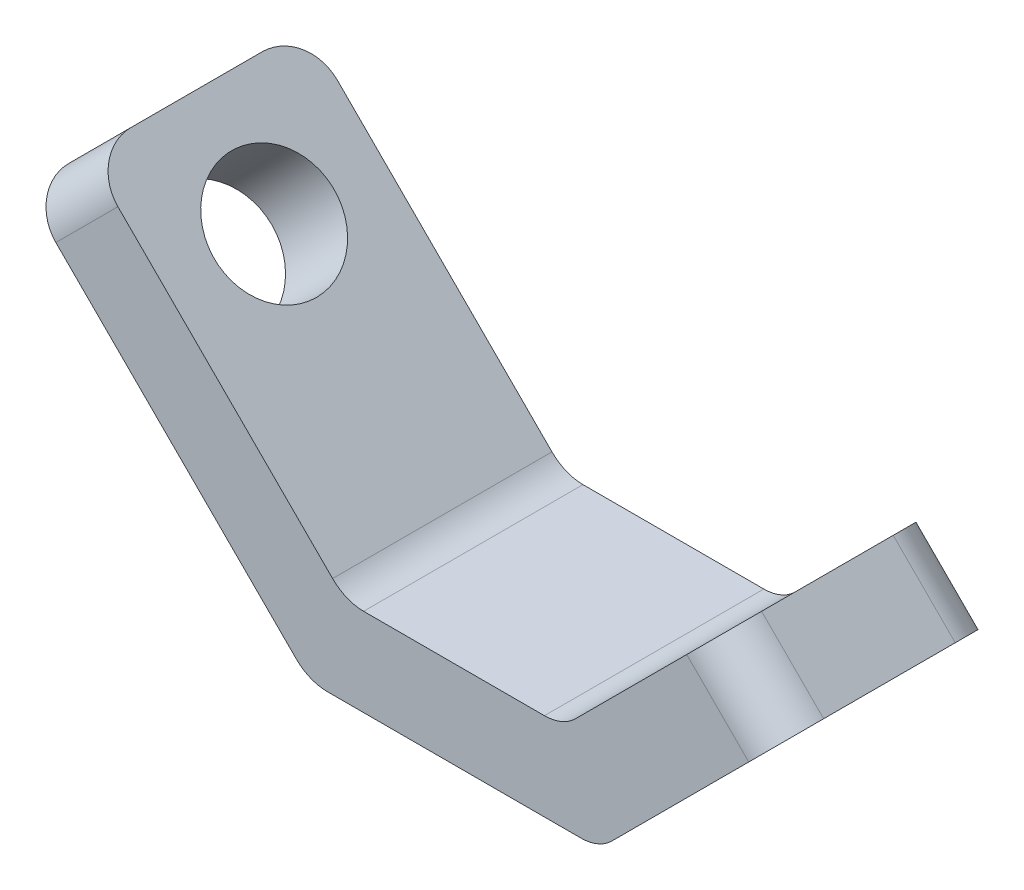
ISO-10303-21;
HEADER;
FILE_DESCRIPTION(('STEP AP214'),'2;1');
FILE_NAME('part.step','',(''),(''),'','','');
FILE_SCHEMA(('AUTOMOTIVE_DESIGN { 1 0 10303 214 1 1 1 1 }'));
ENDSEC;
DATA;
#1=APPLICATION_CONTEXT('core data for automotive mechanical design processes');
#2=APPLICATION_PROTOCOL_DEFINITION('international standard','automotive_design',2000,#1);
#3=PRODUCT_CONTEXT('',#1,'mechanical');
#4=PRODUCT('Part','Part','',(#3));
#5=PRODUCT_RELATED_PRODUCT_CATEGORY('part','',(#4));
#6=PRODUCT_DEFINITION_FORMATION('','',#4);
#7=PRODUCT_DEFINITION_CONTEXT('part definition',#1,'design');
#8=PRODUCT_DEFINITION('design','',#6,#7);
#9=PRODUCT_DEFINITION_SHAPE('','',#8);
#10=(LENGTH_UNIT() NAMED_UNIT(*) SI_UNIT(.MILLI.,.METRE.));
#11=(NAMED_UNIT(*) PLANE_ANGLE_UNIT() SI_UNIT($,.RADIAN.));
#12=(NAMED_UNIT(*) SI_UNIT($,.STERADIAN.) SOLID_ANGLE_UNIT());
#13=UNCERTAINTY_MEASURE_WITH_UNIT(LENGTH_MEASURE(1.E-05),#10,'distance_accuracy_value','');
#14=(GEOMETRIC_REPRESENTATION_CONTEXT(3) GLOBAL_UNCERTAINTY_ASSIGNED_CONTEXT((#13)) GLOBAL_UNIT_ASSIGNED_CONTEXT((#10,
#11,#12)) REPRESENTATION_CONTEXT('',''));
#15=CARTESIAN_POINT('',(0.,0.,0.));
#16=DIRECTION('',(0.,0.,1.));
#17=DIRECTION('',(1.,0.,0.));
#18=AXIS2_PLACEMENT_3D('',#15,#16,#17);
#19=CARTESIAN_POINT('',(19.8198051533946,0.,7.5));
#20=DIRECTION('',(0.,1.,0.));
#21=DIRECTION('',(-1.,0.,0.));
#22=AXIS2_PLACEMENT_3D('',#19,#20,#21);
#23=PLANE('',#22);
#24=DIRECTION('',(1.,0.,0.));
#25=VECTOR('',#24,1.);
#26=CARTESIAN_POINT('',(19.8198051533946,0.,-7.5));
#27=LINE('',#26,#25);
#28=CARTESIAN_POINT('',(1.2426406871193,0.,-7.5));
#29=VERTEX_POINT('',#28);
#30=CARTESIAN_POINT('',(18.5771644662753,0.,-7.5));
#31=VERTEX_POINT('',#30);
#32=EDGE_CURVE('E288',#29,#31,#27,.T.);
#33=ORIENTED_EDGE('',*,*,#32,.T.);
#34=DIRECTION('',(0.,0.,-1.));
#35=VECTOR('',#34,1.);
#36=CARTESIAN_POINT('',(18.5771644662753,0.,7.5));
#37=LINE('',#36,#35);
#38=CARTESIAN_POINT('',(18.5771644662753,0.,7.5));
#39=VERTEX_POINT('',#38);
#40=EDGE_CURVE('E166',#31,#39,#37,.F.);
#41=ORIENTED_EDGE('',*,*,#40,.T.);
#42=DIRECTION('',(1.,0.,0.));
#43=VECTOR('',#42,1.);
#44=CARTESIAN_POINT('',(19.8198051533946,0.,7.5));
#45=LINE('',#44,#43);
#46=CARTESIAN_POINT('',(1.2426406871193,0.,7.5));
#47=VERTEX_POINT('',#46);
#48=EDGE_CURVE('E193',#47,#39,#45,.T.);
#49=ORIENTED_EDGE('',*,*,#48,.F.);
#50=DIRECTION('',(0.,0.,-1.));
#51=VECTOR('',#50,1.);
#52=CARTESIAN_POINT('',(1.24264068711929,0.,7.5));
#53=LINE('',#52,#51);
#54=EDGE_CURVE('E264',#47,#29,#53,.T.);
#55=ORIENTED_EDGE('',*,*,#54,.T.);
#56=EDGE_LOOP('',(#33,#41,#49,#55));
#57=FACE_BOUND('',#56,.T.);
#58=ADVANCED_FACE('F41',(#57),#23,.F.);
#59=CARTESIAN_POINT('',(32.1837661840735,12.363961030679,7.5));
#60=DIRECTION('',(-0.707106781186549,0.707106781186546,0.));
#61=DIRECTION('',(-0.707106781186546,-0.707106781186549,0.));
#62=AXIS2_PLACEMENT_3D('',#59,#60,#61);
#63=PLANE('',#62);
#64=CARTESIAN_POINT('',(26.8804653251744,7.06066017177983,0.));
#65=DIRECTION('',(-0.707106781186549,0.707106781186546,0.));
#66=DIRECTION('',(-0.707106781186546,-0.707106781186549,0.));
#67=AXIS2_PLACEMENT_3D('',#64,#65,#66);
#68=CIRCLE('',#67,4.1);
#69=CARTESIAN_POINT('',(23.9813275223096,4.16152236891498,0.));
#70=VERTEX_POINT('',#69);
#71=EDGE_CURVE('E210',#70,#70,#68,.T.);
#72=ORIENTED_EDGE('',*,*,#71,.T.);
#73=EDGE_LOOP('',(#72));
#74=FACE_BOUND('',#73,.T.);
#75=DIRECTION('',(0.707106781186546,0.707106781186549,0.));
#76=VECTOR('',#75,1.);
#77=CARTESIAN_POINT('',(32.1837661840735,12.363961030679,-7.5));
#78=LINE('',#77,#76);
#79=CARTESIAN_POINT('',(20.698484809835,0.878679656440361,-7.5));
#80=VERTEX_POINT('',#79);
#81=CARTESIAN_POINT('',(30.0624458405139,10.2426406871193,-7.5));
#82=VERTEX_POINT('',#81);
#83=EDGE_CURVE('E187',#80,#82,#78,.T.);
#84=ORIENTED_EDGE('',*,*,#83,.T.);
#85=CARTESIAN_POINT('',(30.0624458405139,10.2426406871193,-4.5));
#86=DIRECTION('',(-0.707106781186549,0.707106781186546,0.));
#87=DIRECTION('',(-0.707106781186546,-0.707106781186549,0.));
#88=AXIS2_PLACEMENT_3D('',#85,#86,#87);
#89=CIRCLE('',#88,3.);
#90=CARTESIAN_POINT('',(32.1837661840735,12.363961030679,-4.5));
#91=VERTEX_POINT('',#90);
#92=EDGE_CURVE('E244',#82,#91,#89,.F.);
#93=ORIENTED_EDGE('',*,*,#92,.T.);
#94=DIRECTION('',(0.,0.,-1.));
#95=VECTOR('',#94,1.);
#96=CARTESIAN_POINT('',(32.1837661840735,12.363961030679,7.5));
#97=LINE('',#96,#95);
#98=CARTESIAN_POINT('',(32.1837661840735,12.363961030679,4.5));
#99=VERTEX_POINT('',#98);
#100=EDGE_CURVE('E203',#99,#91,#97,.T.);
#101=ORIENTED_EDGE('',*,*,#100,.F.);
#102=CARTESIAN_POINT('',(30.0624458405139,10.2426406871193,4.5));
#103=DIRECTION('',(-0.707106781186549,0.707106781186546,0.));
#104=DIRECTION('',(-0.707106781186546,-0.707106781186549,0.));
#105=AXIS2_PLACEMENT_3D('',#102,#103,#104);
#106=CIRCLE('',#105,3.);
#107=CARTESIAN_POINT('',(30.0624458405139,10.2426406871193,7.5));
#108=VERTEX_POINT('',#107);
#109=EDGE_CURVE('E242',#99,#108,#106,.F.);
#110=ORIENTED_EDGE('',*,*,#109,.T.);
#111=DIRECTION('',(0.707106781186546,0.707106781186549,0.));
#112=VECTOR('',#111,1.);
#113=CARTESIAN_POINT('',(32.1837661840735,12.363961030679,7.5));
#114=LINE('',#113,#112);
#115=CARTESIAN_POINT('',(20.698484809835,0.878679656440361,7.5));
#116=VERTEX_POINT('',#115);
#117=EDGE_CURVE('E277',#116,#108,#114,.T.);
#118=ORIENTED_EDGE('',*,*,#117,.F.);
#119=DIRECTION('',(0.,0.,-1.));
#120=VECTOR('',#119,1.);
#121=CARTESIAN_POINT('',(20.698484809835,0.878679656440361,7.5));
#122=LINE('',#121,#120);
#123=EDGE_CURVE('E239',#116,#80,#122,.T.);
#124=ORIENTED_EDGE('',*,*,#123,.T.);
#125=EDGE_LOOP('',(#84,#93,#101,#110,#118,#124));
#126=FACE_BOUND('',#125,.T.);
#127=ADVANCED_FACE('F294',(#74,#126),#63,.F.);
#128=CARTESIAN_POINT('',(27.9411254969542,16.6066017177982,7.5));
#129=DIRECTION('',(-0.707106781186547,-0.707106781186548,0.));
#130=DIRECTION('',(0.707106781186548,-0.707106781186547,0.));
#131=AXIS2_PLACEMENT_3D('',#128,#129,#130);
#132=PLANE('',#131);
#133=ORIENTED_EDGE('',*,*,#100,.T.);
#134=DIRECTION('',(-0.707106781186548,0.707106781186547,0.));
#135=VECTOR('',#134,1.);
#136=CARTESIAN_POINT('',(27.9411254969542,16.6066017177982,-4.5));
#137=LINE('',#136,#135);
#138=CARTESIAN_POINT('',(27.9411254969542,16.6066017177982,-4.5));
#139=VERTEX_POINT('',#138);
#140=EDGE_CURVE('E228',#91,#139,#137,.T.);
#141=ORIENTED_EDGE('',*,*,#140,.T.);
#142=DIRECTION('',(0.,0.,-1.));
#143=VECTOR('',#142,1.);
#144=CARTESIAN_POINT('',(27.9411254969542,16.6066017177982,7.5));
#145=LINE('',#144,#143);
#146=CARTESIAN_POINT('',(27.9411254969542,16.6066017177982,4.5));
#147=VERTEX_POINT('',#146);
#148=EDGE_CURVE('E200',#147,#139,#145,.T.);
#149=ORIENTED_EDGE('',*,*,#148,.F.);
#150=DIRECTION('',(-0.707106781186548,0.707106781186547,0.));
#151=VECTOR('',#150,1.);
#152=CARTESIAN_POINT('',(27.9411254969542,16.6066017177982,4.5));
#153=LINE('',#152,#151);
#154=EDGE_CURVE('E226',#147,#99,#153,.F.);
#155=ORIENTED_EDGE('',*,*,#154,.T.);
#156=EDGE_LOOP('',(#133,#141,#149,#155));
#157=FACE_BOUND('',#156,.T.);
#158=ADVANCED_FACE('F304',(#157),#132,.F.);
#159=CARTESIAN_POINT('',(17.334523779156,5.99999999999999,7.5));
#160=DIRECTION('',(0.70710678118655,-0.707106781186545,0.));
#161=DIRECTION('',(0.707106781186545,0.70710678118655,0.));
#162=AXIS2_PLACEMENT_3D('',#159,#160,#161);
#163=PLANE('',#162);
#164=CARTESIAN_POINT('',(22.6378246380551,11.3033008588991,0.));
#165=DIRECTION('',(0.70710678118655,-0.707106781186545,0.));
#166=DIRECTION('',(0.707106781186545,0.70710678118655,0.));
#167=AXIS2_PLACEMENT_3D('',#164,#165,#166);
#168=CIRCLE('',#167,4.1);
#169=CARTESIAN_POINT('',(25.53696244092,14.202438661764,0.));
#170=VERTEX_POINT('',#169);
#171=EDGE_CURVE('E211',#170,#170,#168,.T.);
#172=ORIENTED_EDGE('',*,*,#171,.T.);
#173=EDGE_LOOP('',(#172));
#174=FACE_BOUND('',#173,.T.);
#175=DIRECTION('',(-0.707106781186545,-0.70710678118655,0.));
#176=VECTOR('',#175,1.);
#177=CARTESIAN_POINT('',(17.334523779156,5.99999999999999,-7.5));
#178=LINE('',#177,#176);
#179=CARTESIAN_POINT('',(25.8198051533946,14.4852813742386,-7.5));
#180=VERTEX_POINT('',#179);
#181=CARTESIAN_POINT('',(18.2132034355964,6.87867965644035,-7.5));
#182=VERTEX_POINT('',#181);
#183=EDGE_CURVE('E182',#180,#182,#178,.T.);
#184=ORIENTED_EDGE('',*,*,#183,.T.);
#185=DIRECTION('',(0.,0.,-1.));
#186=VECTOR('',#185,1.);
#187=CARTESIAN_POINT('',(18.2132034355964,6.87867965644035,7.5));
#188=LINE('',#187,#186);
#189=CARTESIAN_POINT('',(18.2132034355964,6.87867965644035,7.5));
#190=VERTEX_POINT('',#189);
#191=EDGE_CURVE('E160',#182,#190,#188,.F.);
#192=ORIENTED_EDGE('',*,*,#191,.T.);
#193=DIRECTION('',(-0.707106781186545,-0.70710678118655,0.));
#194=VECTOR('',#193,1.);
#195=CARTESIAN_POINT('',(17.334523779156,5.99999999999999,7.5));
#196=LINE('',#195,#194);
#197=CARTESIAN_POINT('',(25.8198051533946,14.4852813742386,7.5));
#198=VERTEX_POINT('',#197);
#199=EDGE_CURVE('E274',#198,#190,#196,.T.);
#200=ORIENTED_EDGE('',*,*,#199,.F.);
#201=CARTESIAN_POINT('',(25.8198051533946,14.4852813742386,4.5));
#202=DIRECTION('',(0.70710678118655,-0.707106781186545,0.));
#203=DIRECTION('',(0.707106781186545,0.70710678118655,0.));
#204=AXIS2_PLACEMENT_3D('',#201,#202,#203);
#205=CIRCLE('',#204,3.);
#206=EDGE_CURVE('E176',#198,#147,#205,.F.);
#207=ORIENTED_EDGE('',*,*,#206,.T.);
#208=ORIENTED_EDGE('',*,*,#148,.T.);
#209=CARTESIAN_POINT('',(25.8198051533946,14.4852813742386,-4.5));
#210=DIRECTION('',(0.70710678118655,-0.707106781186545,0.));
#211=DIRECTION('',(0.707106781186545,0.70710678118655,0.));
#212=AXIS2_PLACEMENT_3D('',#209,#210,#211);
#213=CIRCLE('',#212,3.);
#214=EDGE_CURVE('E216',#139,#180,#213,.F.);
#215=ORIENTED_EDGE('',*,*,#214,.T.);
#216=EDGE_LOOP('',(#184,#192,#200,#207,#208,#215));
#217=FACE_BOUND('',#216,.T.);
#218=ADVANCED_FACE('F306',(#174,#217),#163,.F.);
#219=CARTESIAN_POINT('',(2.48528137423863,5.99999999999997,7.5));
#220=DIRECTION('',(0.,-1.,0.));
#221=DIRECTION('',(1.,0.,0.));
#222=AXIS2_PLACEMENT_3D('',#219,#220,#221);
#223=PLANE('',#222);
#224=DIRECTION('',(-1.,0.,0.));
#225=VECTOR('',#224,1.);
#226=CARTESIAN_POINT('',(2.48528137423863,5.99999999999997,7.5));
#227=LINE('',#226,#225);
#228=CARTESIAN_POINT('',(16.0918830920367,5.99999999999999,7.5));
#229=VERTEX_POINT('',#228);
#230=CARTESIAN_POINT('',(3.72792206135792,5.99999999999997,7.5));
#231=VERTEX_POINT('',#230);
#232=EDGE_CURVE('E175',#229,#231,#227,.T.);
#233=ORIENTED_EDGE('',*,*,#232,.F.);
#234=DIRECTION('',(0.,0.,-1.));
#235=VECTOR('',#234,1.);
#236=CARTESIAN_POINT('',(16.0918830920367,5.99999999999999,-7.5));
#237=LINE('',#236,#235);
#238=CARTESIAN_POINT('',(16.0918830920367,5.99999999999999,-7.5));
#239=VERTEX_POINT('',#238);
#240=EDGE_CURVE('E159',#229,#239,#237,.T.);
#241=ORIENTED_EDGE('',*,*,#240,.T.);
#242=DIRECTION('',(-1.,0.,0.));
#243=VECTOR('',#242,1.);
#244=CARTESIAN_POINT('',(2.48528137423863,5.99999999999997,-7.5));
#245=LINE('',#244,#243);
#246=CARTESIAN_POINT('',(3.72792206135792,5.99999999999997,-7.5));
#247=VERTEX_POINT('',#246);
#248=EDGE_CURVE('E172',#239,#247,#245,.T.);
#249=ORIENTED_EDGE('',*,*,#248,.T.);
#250=DIRECTION('',(0.,0.,-1.));
#251=VECTOR('',#250,1.);
#252=CARTESIAN_POINT('',(3.72792206135792,5.99999999999997,7.5));
#253=LINE('',#252,#251);
#254=EDGE_CURVE('E177',#247,#231,#253,.F.);
#255=ORIENTED_EDGE('',*,*,#254,.T.);
#256=EDGE_LOOP('',(#233,#241,#249,#255));
#257=FACE_BOUND('',#256,.T.);
#258=ADVANCED_FACE('F171',(#257),#223,.F.);
#259=CARTESIAN_POINT('',(-15.1923881554251,23.6776695296637,7.5));
#260=DIRECTION('',(-0.707106781186548,-0.707106781186547,0.));
#261=DIRECTION('',(0.707106781186547,-0.707106781186548,0.));
#262=AXIS2_PLACEMENT_3D('',#259,#260,#261);
#263=PLANE('',#262);
#264=CARTESIAN_POINT('',(-9.88908729652594,18.3743686707645,0.));
#265=DIRECTION('',(-0.707106781186548,-0.707106781186547,0.));
#266=DIRECTION('',(0.707106781186547,-0.707106781186548,0.));
#267=AXIS2_PLACEMENT_3D('',#264,#265,#266);
#268=CIRCLE('',#267,4.1);
#269=CARTESIAN_POINT('',(-6.98994949366109,15.4752308678997,0.));
#270=VERTEX_POINT('',#269);
#271=EDGE_CURVE('E209',#270,#270,#268,.T.);
#272=ORIENTED_EDGE('',*,*,#271,.T.);
#273=EDGE_LOOP('',(#272));
#274=FACE_BOUND('',#273,.T.);
#275=DIRECTION('',(-0.707106781186547,0.707106781186548,0.));
#276=VECTOR('',#275,1.);
#277=CARTESIAN_POINT('',(-15.1923881554251,23.6776695296637,7.5));
#278=LINE('',#277,#276);
#279=CARTESIAN_POINT('',(1.60660171779827,6.87867965644032,7.5));
#280=VERTEX_POINT('',#279);
#281=CARTESIAN_POINT('',(-13.0710678118654,21.556349186104,7.5));
#282=VERTEX_POINT('',#281);
#283=EDGE_CURVE('E279',#280,#282,#278,.T.);
#284=ORIENTED_EDGE('',*,*,#283,.F.);
#285=DIRECTION('',(0.,0.,-1.));
#286=VECTOR('',#285,1.);
#287=CARTESIAN_POINT('',(1.60660171779827,6.87867965644032,-7.5));
#288=LINE('',#287,#286);
#289=CARTESIAN_POINT('',(1.60660171779827,6.87867965644032,-7.5));
#290=VERTEX_POINT('',#289);
#291=EDGE_CURVE('E223',#280,#290,#288,.T.);
#292=ORIENTED_EDGE('',*,*,#291,.T.);
#293=DIRECTION('',(-0.707106781186547,0.707106781186548,0.));
#294=VECTOR('',#293,1.);
#295=CARTESIAN_POINT('',(-15.1923881554251,23.6776695296637,-7.5));
#296=LINE('',#295,#294);
#297=CARTESIAN_POINT('',(-13.0710678118654,21.556349186104,-7.5));
#298=VERTEX_POINT('',#297);
#299=EDGE_CURVE('E181',#290,#298,#296,.T.);
#300=ORIENTED_EDGE('',*,*,#299,.T.);
#301=CARTESIAN_POINT('',(-13.0710678118654,21.556349186104,-4.5));
#302=DIRECTION('',(-0.707106781186548,-0.707106781186547,0.));
#303=DIRECTION('',(0.707106781186547,-0.707106781186548,0.));
#304=AXIS2_PLACEMENT_3D('',#301,#302,#303);
#305=CIRCLE('',#304,3.);
#306=CARTESIAN_POINT('',(-15.1923881554251,23.6776695296637,-4.5));
#307=VERTEX_POINT('',#306);
#308=EDGE_CURVE('E221',#298,#307,#305,.F.);
#309=ORIENTED_EDGE('',*,*,#308,.T.);
#310=DIRECTION('',(0.,0.,-1.));
#311=VECTOR('',#310,1.);
#312=CARTESIAN_POINT('',(-15.1923881554251,23.6776695296637,7.5));
#313=LINE('',#312,#311);
#314=CARTESIAN_POINT('',(-15.1923881554251,23.6776695296637,4.5));
#315=VERTEX_POINT('',#314);
#316=EDGE_CURVE('E196',#315,#307,#313,.T.);
#317=ORIENTED_EDGE('',*,*,#316,.F.);
#318=CARTESIAN_POINT('',(-13.0710678118654,21.556349186104,4.5));
#319=DIRECTION('',(-0.707106781186548,-0.707106781186547,0.));
#320=DIRECTION('',(0.707106781186547,-0.707106781186548,0.));
#321=AXIS2_PLACEMENT_3D('',#318,#319,#320);
#322=CIRCLE('',#321,3.);
#323=EDGE_CURVE('E219',#315,#282,#322,.F.);
#324=ORIENTED_EDGE('',*,*,#323,.T.);
#325=EDGE_LOOP('',(#284,#292,#300,#309,#317,#324));
#326=FACE_BOUND('',#325,.T.);
#327=ADVANCED_FACE('F334',(#274,#326),#263,.F.);
#328=CARTESIAN_POINT('',(-19.4350288425444,19.4350288425444,7.5));
#329=DIRECTION('',(0.707106781186547,-0.707106781186547,0.));
#330=DIRECTION('',(0.707106781186548,0.707106781186548,0.));
#331=AXIS2_PLACEMENT_3D('',#328,#329,#330);
#332=PLANE('',#331);
#333=ORIENTED_EDGE('',*,*,#316,.T.);
#334=DIRECTION('',(-0.707106781186548,-0.707106781186548,0.));
#335=VECTOR('',#334,1.);
#336=CARTESIAN_POINT('',(-19.4350288425444,19.4350288425444,-4.5));
#337=LINE('',#336,#335);
#338=CARTESIAN_POINT('',(-19.4350288425444,19.4350288425444,-4.5));
#339=VERTEX_POINT('',#338);
#340=EDGE_CURVE('E258',#307,#339,#337,.T.);
#341=ORIENTED_EDGE('',*,*,#340,.T.);
#342=DIRECTION('',(0.,0.,-1.));
#343=VECTOR('',#342,1.);
#344=CARTESIAN_POINT('',(-19.4350288425444,19.4350288425444,7.5));
#345=LINE('',#344,#343);
#346=CARTESIAN_POINT('',(-19.4350288425444,19.4350288425444,4.5));
#347=VERTEX_POINT('',#346);
#348=EDGE_CURVE('E194',#347,#339,#345,.T.);
#349=ORIENTED_EDGE('',*,*,#348,.F.);
#350=DIRECTION('',(-0.707106781186548,-0.707106781186548,0.));
#351=VECTOR('',#350,1.);
#352=CARTESIAN_POINT('',(-19.4350288425444,19.4350288425444,4.5));
#353=LINE('',#352,#351);
#354=EDGE_CURVE('E256',#347,#315,#353,.F.);
#355=ORIENTED_EDGE('',*,*,#354,.T.);
#356=EDGE_LOOP('',(#333,#341,#349,#355));
#357=FACE_BOUND('',#356,.T.);
#358=ADVANCED_FACE('F326',(#357),#332,.F.);
#359=CARTESIAN_POINT('',(0.,0.,7.5));
#360=DIRECTION('',(0.707106781186548,0.707106781186547,0.));
#361=DIRECTION('',(-0.707106781186547,0.707106781186548,0.));
#362=AXIS2_PLACEMENT_3D('',#359,#360,#361);
#363=PLANE('',#362);
#364=CARTESIAN_POINT('',(-14.1317279836452,14.1317279836452,0.));
#365=DIRECTION('',(0.707106781186548,0.707106781186547,0.));
#366=DIRECTION('',(-0.707106781186547,0.707106781186548,0.));
#367=AXIS2_PLACEMENT_3D('',#364,#365,#366);
#368=CIRCLE('',#367,4.1);
#369=CARTESIAN_POINT('',(-17.0308657865101,17.0308657865101,0.));
#370=VERTEX_POINT('',#369);
#371=EDGE_CURVE('E206',#370,#370,#368,.T.);
#372=ORIENTED_EDGE('',*,*,#371,.T.);
#373=EDGE_LOOP('',(#372));
#374=FACE_BOUND('',#373,.T.);
#375=ORIENTED_EDGE('',*,*,#348,.T.);
#376=CARTESIAN_POINT('',(-17.3137084989847,17.3137084989847,-4.5));
#377=DIRECTION('',(0.707106781186548,0.707106781186547,0.));
#378=DIRECTION('',(-0.707106781186547,0.707106781186548,0.));
#379=AXIS2_PLACEMENT_3D('',#376,#377,#378);
#380=CIRCLE('',#379,3.);
#381=CARTESIAN_POINT('',(-17.3137084989847,17.3137084989847,-7.5));
#382=VERTEX_POINT('',#381);
#383=EDGE_CURVE('E56',#339,#382,#380,.F.);
#384=ORIENTED_EDGE('',*,*,#383,.T.);
#385=DIRECTION('',(0.707106781186547,-0.707106781186548,0.));
#386=VECTOR('',#385,1.);
#387=CARTESIAN_POINT('',(0.,0.,-7.5));
#388=LINE('',#387,#386);
#389=CARTESIAN_POINT('',(-0.878679656440356,0.878679656440356,-7.5));
#390=VERTEX_POINT('',#389);
#391=EDGE_CURVE('E185',#382,#390,#388,.T.);
#392=ORIENTED_EDGE('',*,*,#391,.T.);
#393=DIRECTION('',(0.,0.,-1.));
#394=VECTOR('',#393,1.);
#395=CARTESIAN_POINT('',(-0.878679656440356,0.878679656440356,7.5));
#396=LINE('',#395,#394);
#397=CARTESIAN_POINT('',(-0.878679656440356,0.878679656440356,7.5));
#398=VERTEX_POINT('',#397);
#399=EDGE_CURVE('E260',#390,#398,#396,.F.);
#400=ORIENTED_EDGE('',*,*,#399,.T.);
#401=DIRECTION('',(0.707106781186547,-0.707106781186548,0.));
#402=VECTOR('',#401,1.);
#403=CARTESIAN_POINT('',(0.,0.,7.5));
#404=LINE('',#403,#402);
#405=CARTESIAN_POINT('',(-17.3137084989847,17.3137084989847,7.5));
#406=VERTEX_POINT('',#405);
#407=EDGE_CURVE('E197',#406,#398,#404,.T.);
#408=ORIENTED_EDGE('',*,*,#407,.F.);
#409=CARTESIAN_POINT('',(-17.3137084989847,17.3137084989847,4.5));
#410=DIRECTION('',(0.707106781186548,0.707106781186547,0.));
#411=DIRECTION('',(-0.707106781186547,0.707106781186548,0.));
#412=AXIS2_PLACEMENT_3D('',#409,#410,#411);
#413=CIRCLE('',#412,3.);
#414=EDGE_CURVE('E64',#406,#347,#413,.F.);
#415=ORIENTED_EDGE('',*,*,#414,.T.);
#416=EDGE_LOOP('',(#375,#384,#392,#400,#408,#415));
#417=FACE_BOUND('',#416,.T.);
#418=ADVANCED_FACE('F323',(#374,#417),#363,.F.);
#419=CARTESIAN_POINT('',(0.,0.,7.5));
#420=DIRECTION('',(0.,0.,-1.));
#421=DIRECTION('',(-1.,0.,0.));
#422=AXIS2_PLACEMENT_3D('',#419,#420,#421);
#423=PLANE('',#422);
#424=ORIENTED_EDGE('',*,*,#117,.T.);
#425=DIRECTION('',(-0.707106781186548,0.707106781186547,0.));
#426=VECTOR('',#425,1.);
#427=CARTESIAN_POINT('',(20.1525432638166,20.1525432638166,7.5));
#428=LINE('',#427,#426);
#429=EDGE_CURVE('E253',#108,#198,#428,.T.);
#430=ORIENTED_EDGE('',*,*,#429,.T.);
#431=ORIENTED_EDGE('',*,*,#199,.T.);
#432=CARTESIAN_POINT('',(16.0918830920367,8.99999999999999,7.5));
#433=DIRECTION('',(0.,0.,-1.));
#434=DIRECTION('',(-1.,0.,0.));
#435=AXIS2_PLACEMENT_3D('',#432,#433,#434);
#436=CIRCLE('',#435,3.);
#437=EDGE_CURVE('E165',#190,#229,#436,.T.);
#438=ORIENTED_EDGE('',*,*,#437,.T.);
#439=ORIENTED_EDGE('',*,*,#232,.T.);
#440=CARTESIAN_POINT('',(3.72792206135792,8.99999999999997,7.5));
#441=DIRECTION('',(0.,0.,-1.));
#442=DIRECTION('',(-1.,0.,0.));
#443=AXIS2_PLACEMENT_3D('',#440,#441,#442);
#444=CIRCLE('',#443,3.);
#445=EDGE_CURVE('E11',#231,#280,#444,.T.);
#446=ORIENTED_EDGE('',*,*,#445,.T.);
#447=ORIENTED_EDGE('',*,*,#283,.T.);
#448=DIRECTION('',(-0.707106781186548,-0.707106781186548,0.));
#449=VECTOR('',#448,1.);
#450=CARTESIAN_POINT('',(-17.3137084989847,17.3137084989847,7.5));
#451=LINE('',#450,#449);
#452=EDGE_CURVE('E250',#282,#406,#451,.T.);
#453=ORIENTED_EDGE('',*,*,#452,.T.);
#454=ORIENTED_EDGE('',*,*,#407,.T.);
#455=CARTESIAN_POINT('',(1.24264068711929,3.,7.5));
#456=DIRECTION('',(0.,0.,-1.));
#457=DIRECTION('',(-1.,0.,0.));
#458=AXIS2_PLACEMENT_3D('',#455,#456,#457);
#459=CIRCLE('',#458,3.);
#460=EDGE_CURVE('E246',#398,#47,#459,.F.);
#461=ORIENTED_EDGE('',*,*,#460,.T.);
#462=ORIENTED_EDGE('',*,*,#48,.T.);
#463=CARTESIAN_POINT('',(18.5771644662753,3.,7.5));
#464=DIRECTION('',(0.,0.,-1.));
#465=DIRECTION('',(-1.,0.,0.));
#466=AXIS2_PLACEMENT_3D('',#463,#464,#465);
#467=CIRCLE('',#466,3.);
#468=EDGE_CURVE('E248',#39,#116,#467,.F.);
#469=ORIENTED_EDGE('',*,*,#468,.T.);
#470=EDGE_LOOP('',(#424,#430,#431,#438,#439,#446,#447,#453,#454,#461,#462,#469));
#471=FACE_BOUND('',#470,.T.);
#472=ADVANCED_FACE('F271',(#471),#423,.F.);
#473=CARTESIAN_POINT('',(0.,0.,-7.5));
#474=DIRECTION('',(0.,0.,-1.));
#475=DIRECTION('',(-1.,0.,0.));
#476=AXIS2_PLACEMENT_3D('',#473,#474,#475);
#477=PLANE('',#476);
#478=ORIENTED_EDGE('',*,*,#183,.F.);
#479=DIRECTION('',(-0.707106781186548,0.707106781186547,0.));
#480=VECTOR('',#479,1.);
#481=CARTESIAN_POINT('',(30.0624458405139,10.2426406871193,-7.5));
#482=LINE('',#481,#480);
#483=EDGE_CURVE('E237',#180,#82,#482,.F.);
#484=ORIENTED_EDGE('',*,*,#483,.T.);
#485=ORIENTED_EDGE('',*,*,#83,.F.);
#486=CARTESIAN_POINT('',(18.5771644662753,3.,-7.5));
#487=DIRECTION('',(0.,0.,-1.));
#488=DIRECTION('',(-1.,0.,0.));
#489=AXIS2_PLACEMENT_3D('',#486,#487,#488);
#490=CIRCLE('',#489,3.);
#491=EDGE_CURVE('E233',#80,#31,#490,.T.);
#492=ORIENTED_EDGE('',*,*,#491,.T.);
#493=ORIENTED_EDGE('',*,*,#32,.F.);
#494=CARTESIAN_POINT('',(1.24264068711929,3.,-7.5));
#495=DIRECTION('',(0.,0.,-1.));
#496=DIRECTION('',(-1.,0.,0.));
#497=AXIS2_PLACEMENT_3D('',#494,#495,#496);
#498=CIRCLE('',#497,3.);
#499=EDGE_CURVE('E231',#29,#390,#498,.T.);
#500=ORIENTED_EDGE('',*,*,#499,.T.);
#501=ORIENTED_EDGE('',*,*,#391,.F.);
#502=DIRECTION('',(-0.707106781186548,-0.707106781186548,0.));
#503=VECTOR('',#502,1.);
#504=CARTESIAN_POINT('',(-13.0710678118654,21.556349186104,-7.5));
#505=LINE('',#504,#503);
#506=EDGE_CURVE('E235',#382,#298,#505,.F.);
#507=ORIENTED_EDGE('',*,*,#506,.T.);
#508=ORIENTED_EDGE('',*,*,#299,.F.);
#509=CARTESIAN_POINT('',(3.72792206135792,8.99999999999997,-7.5));
#510=DIRECTION('',(0.,0.,-1.));
#511=DIRECTION('',(-1.,0.,0.));
#512=AXIS2_PLACEMENT_3D('',#509,#510,#511);
#513=CIRCLE('',#512,3.);
#514=EDGE_CURVE('E49',#290,#247,#513,.F.);
#515=ORIENTED_EDGE('',*,*,#514,.T.);
#516=ORIENTED_EDGE('',*,*,#248,.F.);
#517=CARTESIAN_POINT('',(16.0918830920367,8.99999999999999,-7.5));
#518=DIRECTION('',(0.,0.,-1.));
#519=DIRECTION('',(-1.,0.,0.));
#520=AXIS2_PLACEMENT_3D('',#517,#518,#519);
#521=CIRCLE('',#520,3.);
#522=EDGE_CURVE('E155',#239,#182,#521,.F.);
#523=ORIENTED_EDGE('',*,*,#522,.T.);
#524=EDGE_LOOP('',(#478,#484,#485,#492,#493,#500,#501,#507,#508,#515,#516,#523));
#525=FACE_BOUND('',#524,.T.);
#526=ADVANCED_FACE('F179',(#525),#477,.T.);
#527=CARTESIAN_POINT('',(13.7989898732234,42.0624458405138,0.));
#528=DIRECTION('',(-0.707106781186549,-0.707106781186546,0.));
#529=DIRECTION('',(0.707106781186546,-0.707106781186549,0.));
#530=AXIS2_PLACEMENT_3D('',#527,#528,#529);
#531=CYLINDRICAL_SURFACE('',#530,4.1);
#532=ORIENTED_EDGE('',*,*,#371,.F.);
#533=EDGE_LOOP('',(#532));
#534=FACE_BOUND('',#533,.T.);
#535=ORIENTED_EDGE('',*,*,#271,.F.);
#536=EDGE_LOOP('',(#535));
#537=FACE_BOUND('',#536,.T.);
#538=ADVANCED_FACE('F429',(#534,#537),#531,.F.);
#539=CARTESIAN_POINT('',(-4.58578643762697,38.5269119345811,0.));
#540=DIRECTION('',(0.707106781186549,-0.707106781186546,0.));
#541=DIRECTION('',(0.707106781186546,0.707106781186549,0.));
#542=AXIS2_PLACEMENT_3D('',#539,#540,#541);
#543=CYLINDRICAL_SURFACE('',#542,4.1);
#544=ORIENTED_EDGE('',*,*,#171,.F.);
#545=EDGE_LOOP('',(#544));
#546=FACE_BOUND('',#545,.T.);
#547=ORIENTED_EDGE('',*,*,#71,.F.);
#548=EDGE_LOOP('',(#547));
#549=FACE_BOUND('',#548,.T.);
#550=ADVANCED_FACE('F359',(#546,#549),#543,.F.);
#551=CARTESIAN_POINT('',(16.0918830920367,8.99999999999999,7.5));
#552=DIRECTION('',(0.,0.,1.));
#553=DIRECTION('',(1.,0.,0.));
#554=AXIS2_PLACEMENT_3D('',#551,#552,#553);
#555=CYLINDRICAL_SURFACE('',#554,3.);
#556=ORIENTED_EDGE('',*,*,#437,.F.);
#557=ORIENTED_EDGE('',*,*,#191,.F.);
#558=ORIENTED_EDGE('',*,*,#522,.F.);
#559=ORIENTED_EDGE('',*,*,#240,.F.);
#560=EDGE_LOOP('',(#556,#557,#558,#559));
#561=FACE_BOUND('',#560,.T.);
#562=ADVANCED_FACE('F158',(#561),#555,.F.);
#563=CARTESIAN_POINT('',(3.72792206135792,8.99999999999997,7.5));
#564=DIRECTION('',(0.,0.,1.));
#565=DIRECTION('',(1.,0.,0.));
#566=AXIS2_PLACEMENT_3D('',#563,#564,#565);
#567=CYLINDRICAL_SURFACE('',#566,3.);
#568=ORIENTED_EDGE('',*,*,#445,.F.);
#569=ORIENTED_EDGE('',*,*,#254,.F.);
#570=ORIENTED_EDGE('',*,*,#514,.F.);
#571=ORIENTED_EDGE('',*,*,#291,.F.);
#572=EDGE_LOOP('',(#568,#569,#570,#571));
#573=FACE_BOUND('',#572,.T.);
#574=ADVANCED_FACE('F337',(#573),#567,.F.);
#575=CARTESIAN_POINT('',(25.8198051533946,14.4852813742386,-4.5));
#576=DIRECTION('',(0.707106781186548,-0.707106781186547,0.));
#577=DIRECTION('',(0.707106781186547,0.707106781186548,0.));
#578=AXIS2_PLACEMENT_3D('',#575,#576,#577);
#579=CYLINDRICAL_SURFACE('',#578,3.);
#580=ORIENTED_EDGE('',*,*,#92,.F.);
#581=ORIENTED_EDGE('',*,*,#483,.F.);
#582=ORIENTED_EDGE('',*,*,#214,.F.);
#583=ORIENTED_EDGE('',*,*,#140,.F.);
#584=EDGE_LOOP('',(#580,#581,#582,#583));
#585=FACE_BOUND('',#584,.T.);
#586=ADVANCED_FACE('F301',(#585),#579,.T.);
#587=CARTESIAN_POINT('',(20.1525432638166,20.1525432638166,4.5));
#588=DIRECTION('',(-0.707106781186548,0.707106781186547,0.));
#589=DIRECTION('',(-0.707106781186547,-0.707106781186548,0.));
#590=AXIS2_PLACEMENT_3D('',#587,#588,#589);
#591=CYLINDRICAL_SURFACE('',#590,3.);
#592=ORIENTED_EDGE('',*,*,#109,.F.);
#593=ORIENTED_EDGE('',*,*,#154,.F.);
#594=ORIENTED_EDGE('',*,*,#206,.F.);
#595=ORIENTED_EDGE('',*,*,#429,.F.);
#596=EDGE_LOOP('',(#592,#593,#594,#595));
#597=FACE_BOUND('',#596,.T.);
#598=ADVANCED_FACE('F309',(#597),#591,.T.);
#599=CARTESIAN_POINT('',(-17.3137084989847,17.3137084989847,-4.5));
#600=DIRECTION('',(0.707106781186548,0.707106781186548,0.));
#601=DIRECTION('',(-0.707106781186548,0.707106781186548,0.));
#602=AXIS2_PLACEMENT_3D('',#599,#600,#601);
#603=CYLINDRICAL_SURFACE('',#602,3.);
#604=ORIENTED_EDGE('',*,*,#308,.F.);
#605=ORIENTED_EDGE('',*,*,#506,.F.);
#606=ORIENTED_EDGE('',*,*,#383,.F.);
#607=ORIENTED_EDGE('',*,*,#340,.F.);
#608=EDGE_LOOP('',(#604,#605,#606,#607));
#609=FACE_BOUND('',#608,.T.);
#610=ADVANCED_FACE('F339',(#609),#603,.T.);
#611=CARTESIAN_POINT('',(-17.3137084989847,17.3137084989847,4.5));
#612=DIRECTION('',(-0.707106781186548,-0.707106781186548,0.));
#613=DIRECTION('',(0.707106781186548,-0.707106781186548,0.));
#614=AXIS2_PLACEMENT_3D('',#611,#612,#613);
#615=CYLINDRICAL_SURFACE('',#614,3.);
#616=ORIENTED_EDGE('',*,*,#323,.F.);
#617=ORIENTED_EDGE('',*,*,#354,.F.);
#618=ORIENTED_EDGE('',*,*,#414,.F.);
#619=ORIENTED_EDGE('',*,*,#452,.F.);
#620=EDGE_LOOP('',(#616,#617,#618,#619));
#621=FACE_BOUND('',#620,.T.);
#622=ADVANCED_FACE('F330',(#621),#615,.T.);
#623=CARTESIAN_POINT('',(18.5771644662753,3.,7.5));
#624=DIRECTION('',(0.,0.,-1.));
#625=DIRECTION('',(-1.,0.,0.));
#626=AXIS2_PLACEMENT_3D('',#623,#624,#625);
#627=CYLINDRICAL_SURFACE('',#626,3.);
#628=ORIENTED_EDGE('',*,*,#468,.F.);
#629=ORIENTED_EDGE('',*,*,#40,.F.);
#630=ORIENTED_EDGE('',*,*,#491,.F.);
#631=ORIENTED_EDGE('',*,*,#123,.F.);
#632=EDGE_LOOP('',(#628,#629,#630,#631));
#633=FACE_BOUND('',#632,.T.);
#634=ADVANCED_FACE('F315',(#633),#627,.T.);
#635=CARTESIAN_POINT('',(1.24264068711929,3.,7.5));
#636=DIRECTION('',(0.,0.,-1.));
#637=DIRECTION('',(-1.,0.,0.));
#638=AXIS2_PLACEMENT_3D('',#635,#636,#637);
#639=CYLINDRICAL_SURFACE('',#638,3.);
#640=ORIENTED_EDGE('',*,*,#460,.F.);
#641=ORIENTED_EDGE('',*,*,#399,.F.);
#642=ORIENTED_EDGE('',*,*,#499,.F.);
#643=ORIENTED_EDGE('',*,*,#54,.F.);
#644=EDGE_LOOP('',(#640,#641,#642,#643));
#645=FACE_BOUND('',#644,.T.);
#646=ADVANCED_FACE('F43',(#645),#639,.T.);
#647=CLOSED_SHELL('',(#58,#127,#158,#218,#258,#327,#358,#418,#472,#526,#538,#550,#562,#574,#586,
#598,#610,#622,#634,#646));
#648=MANIFOLD_SOLID_BREP('B2',#647);
#649=ADVANCED_BREP_SHAPE_REPRESENTATION('',(#18,#648),#14);
#650=SHAPE_DEFINITION_REPRESENTATION(#9,#649);
ENDSEC;
END-ISO-10303-21;
